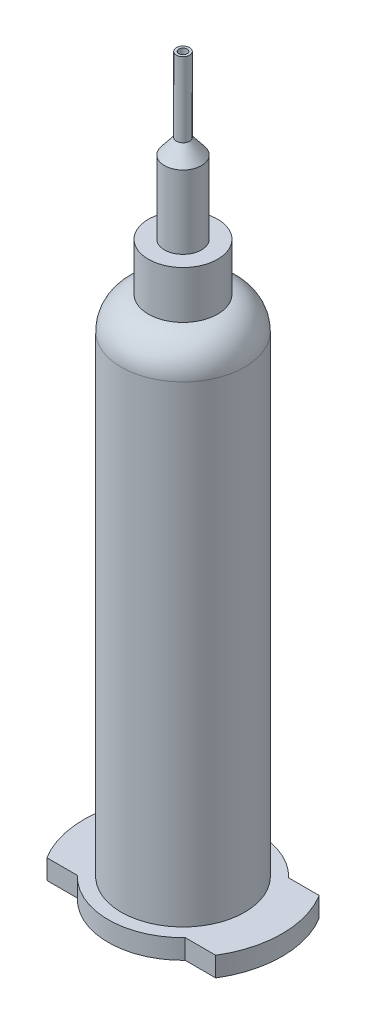
ISO-10303-21;
HEADER;
FILE_DESCRIPTION(('STEP AP214'),'2;1');
FILE_NAME('part.step','',(''),(''),'','','');
FILE_SCHEMA(('AUTOMOTIVE_DESIGN { 1 0 10303 214 1 1 1 1 }'));
ENDSEC;
DATA;
#1=APPLICATION_CONTEXT('core data for automotive mechanical design processes');
#2=APPLICATION_PROTOCOL_DEFINITION('international standard','automotive_design',2000,#1);
#3=PRODUCT_CONTEXT('',#1,'mechanical');
#4=PRODUCT('Part','Part','',(#3));
#5=PRODUCT_RELATED_PRODUCT_CATEGORY('part','',(#4));
#6=PRODUCT_DEFINITION_FORMATION('','',#4);
#7=PRODUCT_DEFINITION_CONTEXT('part definition',#1,'design');
#8=PRODUCT_DEFINITION('design','',#6,#7);
#9=PRODUCT_DEFINITION_SHAPE('','',#8);
#10=(LENGTH_UNIT() NAMED_UNIT(*) SI_UNIT(.MILLI.,.METRE.));
#11=(NAMED_UNIT(*) PLANE_ANGLE_UNIT() SI_UNIT($,.RADIAN.));
#12=(NAMED_UNIT(*) SI_UNIT($,.STERADIAN.) SOLID_ANGLE_UNIT());
#13=UNCERTAINTY_MEASURE_WITH_UNIT(LENGTH_MEASURE(1.E-05),#10,'distance_accuracy_value','');
#14=(GEOMETRIC_REPRESENTATION_CONTEXT(3) GLOBAL_UNCERTAINTY_ASSIGNED_CONTEXT((#13)) GLOBAL_UNIT_ASSIGNED_CONTEXT((#10,
#11,#12)) REPRESENTATION_CONTEXT('',''));
#15=CARTESIAN_POINT('',(0.,0.,0.));
#16=DIRECTION('',(0.,0.,1.));
#17=DIRECTION('',(1.,0.,0.));
#18=AXIS2_PLACEMENT_3D('',#15,#16,#17);
#19=CARTESIAN_POINT('',(0.,1.62000000000002,0.));
#20=DIRECTION('',(0.,1.,0.));
#21=DIRECTION('',(0.,0.,1.));
#22=AXIS2_PLACEMENT_3D('',#19,#20,#21);
#23=CYLINDRICAL_SURFACE('',#22,7.925);
#24=CARTESIAN_POINT('',(0.,1.62000000000002,0.));
#25=DIRECTION('',(0.,1.,0.));
#26=DIRECTION('',(0.,0.,1.));
#27=AXIS2_PLACEMENT_3D('',#24,#25,#26);
#28=CIRCLE('',#27,7.925);
#29=CARTESIAN_POINT('',(0.,1.62000000000002,7.925));
#30=VERTEX_POINT('',#29);
#31=EDGE_CURVE('E11',#30,#30,#28,.T.);
#32=ORIENTED_EDGE('',*,*,#31,.T.);
#33=EDGE_LOOP('',(#32));
#34=FACE_BOUND('',#33,.T.);
#35=CARTESIAN_POINT('',(0.,16.62,0.));
#36=DIRECTION('',(0.,1.,0.));
#37=DIRECTION('',(0.,0.,1.));
#38=AXIS2_PLACEMENT_3D('',#35,#36,#37);
#39=CIRCLE('',#38,7.925);
#40=CARTESIAN_POINT('',(0.,16.62,7.925));
#41=VERTEX_POINT('',#40);
#42=EDGE_CURVE('E52',#41,#41,#39,.T.);
#43=ORIENTED_EDGE('',*,*,#42,.F.);
#44=EDGE_LOOP('',(#43));
#45=FACE_BOUND('',#44,.T.);
#46=ADVANCED_FACE('F49',(#34,#45),#23,.T.);
#47=CARTESIAN_POINT('',(0.,1.62000000000002,0.));
#48=DIRECTION('',(0.,1.,0.));
#49=DIRECTION('',(0.,0.,1.));
#50=AXIS2_PLACEMENT_3D('',#47,#48,#49);
#51=PLANE('',#50);
#52=ORIENTED_EDGE('',*,*,#31,.F.);
#53=EDGE_LOOP('',(#52));
#54=FACE_BOUND('',#53,.T.);
#55=ADVANCED_FACE('F64',(#54),#51,.F.);
#56=CARTESIAN_POINT('',(0.,16.62,0.));
#57=DIRECTION('',(0.,1.,0.));
#58=DIRECTION('',(0.,0.,1.));
#59=AXIS2_PLACEMENT_3D('',#56,#57,#58);
#60=PLANE('',#59);
#61=ORIENTED_EDGE('',*,*,#42,.T.);
#62=EDGE_LOOP('',(#61));
#63=FACE_BOUND('',#62,.T.);
#64=ADVANCED_FACE('F61',(#63),#60,.T.);
#65=CLOSED_SHELL('',(#46,#55,#64));
#66=MANIFOLD_SOLID_BREP('B2',#65);
#67=CARTESIAN_POINT('',(0.,24.5223538498266,0.));
#68=DIRECTION('',(0.,1.,0.));
#69=DIRECTION('',(0.,0.,1.));
#70=AXIS2_PLACEMENT_3D('',#67,#68,#69);
#71=CYLINDRICAL_SURFACE('',#70,15.075);
#72=DIRECTION('',(0.,1.,0.));
#73=VECTOR('',#72,1.);
#74=CARTESIAN_POINT('',(-12.8545711713771,-84.0783145535444,-7.875));
#75=LINE('',#74,#73);
#76=CARTESIAN_POINT('',(-12.8545711713771,-57.38,-7.875));
#77=VERTEX_POINT('',#76);
#78=CARTESIAN_POINT('',(-12.8545711713771,-54.38,-7.875));
#79=VERTEX_POINT('',#78);
#80=EDGE_CURVE('E194',#77,#79,#75,.T.);
#81=ORIENTED_EDGE('',*,*,#80,.F.);
#82=CARTESIAN_POINT('',(0.,-57.38,0.));
#83=DIRECTION('',(0.,1.,0.));
#84=DIRECTION('',(0.,0.,1.));
#85=AXIS2_PLACEMENT_3D('',#82,#83,#84);
#86=CIRCLE('',#85,15.075);
#87=CARTESIAN_POINT('',(-12.8545711713771,-57.38,7.875));
#88=VERTEX_POINT('',#87);
#89=EDGE_CURVE('E182',#77,#88,#86,.T.);
#90=ORIENTED_EDGE('',*,*,#89,.T.);
#91=DIRECTION('',(0.,1.,0.));
#92=VECTOR('',#91,1.);
#93=CARTESIAN_POINT('',(-12.8545711713771,-84.0783145535444,7.875));
#94=LINE('',#93,#92);
#95=CARTESIAN_POINT('',(-12.8545711713771,-54.38,7.875));
#96=VERTEX_POINT('',#95);
#97=EDGE_CURVE('E200',#88,#96,#94,.T.);
#98=ORIENTED_EDGE('',*,*,#97,.T.);
#99=CARTESIAN_POINT('',(0.,-54.38,0.));
#100=DIRECTION('',(0.,1.,0.));
#101=DIRECTION('',(0.,0.,1.));
#102=AXIS2_PLACEMENT_3D('',#99,#100,#101);
#103=CIRCLE('',#102,15.075);
#104=EDGE_CURVE('E197',#79,#96,#103,.T.);
#105=ORIENTED_EDGE('',*,*,#104,.F.);
#106=EDGE_LOOP('',(#81,#90,#98,#105));
#107=FACE_BOUND('',#106,.T.);
#108=ADVANCED_FACE('F96',(#107),#71,.T.);
#109=CARTESIAN_POINT('',(0.,24.5223538498266,0.));
#110=DIRECTION('',(0.,1.,0.));
#111=DIRECTION('',(0.,0.,1.));
#112=AXIS2_PLACEMENT_3D('',#109,#110,#111);
#113=CYLINDRICAL_SURFACE('',#112,1.00000000000001);
#114=CARTESIAN_POINT('',(0.,43.03,0.));
#115=DIRECTION('',(0.,1.,0.));
#116=DIRECTION('',(0.,0.,1.));
#117=AXIS2_PLACEMENT_3D('',#114,#115,#116);
#118=CIRCLE('',#117,1.00000000000001);
#119=CARTESIAN_POINT('',(0.,43.03,1.00000000000001));
#120=VERTEX_POINT('',#119);
#121=EDGE_CURVE('E225',#120,#120,#118,.T.);
#122=ORIENTED_EDGE('',*,*,#121,.T.);
#123=EDGE_LOOP('',(#122));
#124=FACE_BOUND('',#123,.T.);
#125=CARTESIAN_POINT('',(0.,54.38,0.));
#126=DIRECTION('',(0.,1.,0.));
#127=DIRECTION('',(0.,0.,1.));
#128=AXIS2_PLACEMENT_3D('',#125,#126,#127);
#129=CIRCLE('',#128,1.00000000000001);
#130=CARTESIAN_POINT('',(0.,54.38,1.00000000000001));
#131=VERTEX_POINT('',#130);
#132=EDGE_CURVE('E222',#131,#131,#129,.T.);
#133=ORIENTED_EDGE('',*,*,#132,.F.);
#134=EDGE_LOOP('',(#133));
#135=FACE_BOUND('',#134,.T.);
#136=ADVANCED_FACE('F285',(#124,#135),#113,.T.);
#137=CARTESIAN_POINT('',(0.,54.38,0.));
#138=DIRECTION('',(0.,1.,0.));
#139=DIRECTION('',(0.,0.,1.));
#140=AXIS2_PLACEMENT_3D('',#137,#138,#139);
#141=PLANE('',#140);
#142=CARTESIAN_POINT('',(0.,54.38,0.));
#143=DIRECTION('',(0.,1.,0.));
#144=DIRECTION('',(0.,0.,1.));
#145=AXIS2_PLACEMENT_3D('',#142,#143,#144);
#146=CIRCLE('',#145,0.627370955077484);
#147=CARTESIAN_POINT('',(0.,54.38,0.627370955077484));
#148=VERTEX_POINT('',#147);
#149=EDGE_CURVE('E356',#148,#148,#146,.T.);
#150=ORIENTED_EDGE('',*,*,#149,.F.);
#151=EDGE_LOOP('',(#150));
#152=FACE_BOUND('',#151,.T.);
#153=ORIENTED_EDGE('',*,*,#132,.T.);
#154=EDGE_LOOP('',(#153));
#155=FACE_BOUND('',#154,.T.);
#156=ADVANCED_FACE('F283',(#152,#155),#141,.T.);
#157=CARTESIAN_POINT('',(0.,43.03,0.));
#158=DIRECTION('',(0.,-1.,0.));
#159=DIRECTION('',(0.,0.,-1.));
#160=AXIS2_PLACEMENT_3D('',#157,#158,#159);
#161=CONICAL_SURFACE('',#160,1.00000000000001,0.672874277724977);
#162=CARTESIAN_POINT('',(0.,40.74,0.));
#163=DIRECTION('',(0.,1.,0.));
#164=DIRECTION('',(0.,0.,1.));
#165=AXIS2_PLACEMENT_3D('',#162,#163,#164);
#166=CIRCLE('',#165,2.825);
#167=CARTESIAN_POINT('',(0.,40.74,2.825));
#168=VERTEX_POINT('',#167);
#169=EDGE_CURVE('E229',#168,#168,#166,.T.);
#170=ORIENTED_EDGE('',*,*,#169,.T.);
#171=EDGE_LOOP('',(#170));
#172=FACE_BOUND('',#171,.T.);
#173=ORIENTED_EDGE('',*,*,#121,.F.);
#174=EDGE_LOOP('',(#173));
#175=FACE_BOUND('',#174,.T.);
#176=ADVANCED_FACE('F277',(#172,#175),#161,.T.);
#177=CARTESIAN_POINT('',(0.,24.5223538498266,0.));
#178=DIRECTION('',(0.,1.,0.));
#179=DIRECTION('',(0.,0.,1.));
#180=AXIS2_PLACEMENT_3D('',#177,#178,#179);
#181=CYLINDRICAL_SURFACE('',#180,2.825);
#182=CARTESIAN_POINT('',(0.,29.62,0.));
#183=DIRECTION('',(0.,1.,0.));
#184=DIRECTION('',(0.,0.,1.));
#185=AXIS2_PLACEMENT_3D('',#182,#183,#184);
#186=CIRCLE('',#185,2.825);
#187=CARTESIAN_POINT('',(0.,29.62,2.825));
#188=VERTEX_POINT('',#187);
#189=EDGE_CURVE('E232',#188,#188,#186,.T.);
#190=ORIENTED_EDGE('',*,*,#189,.T.);
#191=EDGE_LOOP('',(#190));
#192=FACE_BOUND('',#191,.T.);
#193=ORIENTED_EDGE('',*,*,#169,.F.);
#194=EDGE_LOOP('',(#193));
#195=FACE_BOUND('',#194,.T.);
#196=ADVANCED_FACE('F271',(#192,#195),#181,.T.);
#197=CARTESIAN_POINT('',(0.,29.62,0.));
#198=DIRECTION('',(0.,1.,0.));
#199=DIRECTION('',(0.,0.,1.));
#200=AXIS2_PLACEMENT_3D('',#197,#198,#199);
#201=PLANE('',#200);
#202=CARTESIAN_POINT('',(0.,29.62,0.));
#203=DIRECTION('',(0.,1.,0.));
#204=DIRECTION('',(0.,0.,1.));
#205=AXIS2_PLACEMENT_3D('',#202,#203,#204);
#206=CIRCLE('',#205,5.275);
#207=CARTESIAN_POINT('',(0.,29.62,5.275));
#208=VERTEX_POINT('',#207);
#209=EDGE_CURVE('E235',#208,#208,#206,.T.);
#210=ORIENTED_EDGE('',*,*,#209,.T.);
#211=EDGE_LOOP('',(#210));
#212=FACE_BOUND('',#211,.T.);
#213=ORIENTED_EDGE('',*,*,#189,.F.);
#214=EDGE_LOOP('',(#213));
#215=FACE_BOUND('',#214,.T.);
#216=ADVANCED_FACE('F265',(#212,#215),#201,.T.);
#217=CARTESIAN_POINT('',(0.,24.5223538498266,0.));
#218=DIRECTION('',(0.,1.,0.));
#219=DIRECTION('',(0.,0.,1.));
#220=AXIS2_PLACEMENT_3D('',#217,#218,#219);
#221=CYLINDRICAL_SURFACE('',#220,5.275);
#222=CARTESIAN_POINT('',(0.,22.38,0.));
#223=DIRECTION('',(0.,1.,0.));
#224=DIRECTION('',(0.,0.,1.));
#225=AXIS2_PLACEMENT_3D('',#222,#223,#224);
#226=CIRCLE('',#225,5.275);
#227=CARTESIAN_POINT('',(0.,22.38,5.275));
#228=VERTEX_POINT('',#227);
#229=EDGE_CURVE('E238',#228,#228,#226,.T.);
#230=ORIENTED_EDGE('',*,*,#229,.T.);
#231=EDGE_LOOP('',(#230));
#232=FACE_BOUND('',#231,.T.);
#233=ORIENTED_EDGE('',*,*,#209,.F.);
#234=EDGE_LOOP('',(#233));
#235=FACE_BOUND('',#234,.T.);
#236=ADVANCED_FACE('F262',(#232,#235),#221,.T.);
#237=CARTESIAN_POINT('',(0.,24.5223538498266,0.));
#238=DIRECTION('',(0.,1.,0.));
#239=DIRECTION('',(0.,0.,1.));
#240=AXIS2_PLACEMENT_3D('',#237,#238,#239);
#241=CYLINDRICAL_SURFACE('',#240,9.4);
#242=CARTESIAN_POINT('',(0.,17.4571578331212,0.));
#243=DIRECTION('',(0.,1.,0.));
#244=DIRECTION('',(0.,0.,1.));
#245=AXIS2_PLACEMENT_3D('',#242,#243,#244);
#246=CIRCLE('',#245,9.4);
#247=CARTESIAN_POINT('',(0.,17.4571578331212,9.4));
#248=VERTEX_POINT('',#247);
#249=EDGE_CURVE('E104',#248,#248,#246,.F.);
#250=ORIENTED_EDGE('',*,*,#249,.T.);
#251=EDGE_LOOP('',(#250));
#252=FACE_BOUND('',#251,.T.);
#253=CARTESIAN_POINT('',(0.,-54.38,0.));
#254=DIRECTION('',(0.,1.,0.));
#255=DIRECTION('',(0.,0.,1.));
#256=AXIS2_PLACEMENT_3D('',#253,#254,#255);
#257=CIRCLE('',#256,9.4);
#258=CARTESIAN_POINT('',(0.,-54.38,9.4));
#259=VERTEX_POINT('',#258);
#260=EDGE_CURVE('E241',#259,#259,#257,.T.);
#261=ORIENTED_EDGE('',*,*,#260,.T.);
#262=EDGE_LOOP('',(#261));
#263=FACE_BOUND('',#262,.T.);
#264=ADVANCED_FACE('F251',(#252,#263),#241,.T.);
#265=CARTESIAN_POINT('',(15.075,-57.38,0.));
#266=DIRECTION('',(0.,-1.,0.));
#267=DIRECTION('',(0.,0.,-1.));
#268=AXIS2_PLACEMENT_3D('',#265,#266,#267);
#269=PLANE('',#268);
#270=CARTESIAN_POINT('',(0.,-57.38,0.));
#271=DIRECTION('',(0.,-1.,0.));
#272=DIRECTION('',(0.,0.,-1.));
#273=AXIS2_PLACEMENT_3D('',#270,#271,#272);
#274=CIRCLE('',#273,7.925);
#275=CARTESIAN_POINT('',(0.,-57.38,-7.925));
#276=VERTEX_POINT('',#275);
#277=EDGE_CURVE('E353',#276,#276,#274,.T.);
#278=ORIENTED_EDGE('',*,*,#277,.F.);
#279=EDGE_LOOP('',(#278));
#280=FACE_BOUND('',#279,.T.);
#281=DIRECTION('',(1.,0.,0.));
#282=VECTOR('',#281,1.);
#283=CARTESIAN_POINT('',(-12.8545711713771,-57.38,-7.875));
#284=LINE('',#283,#282);
#285=CARTESIAN_POINT('',(-8.208227579691,-57.38,-7.875));
#286=VERTEX_POINT('',#285);
#287=EDGE_CURVE('E173',#77,#286,#284,.T.);
#288=ORIENTED_EDGE('',*,*,#287,.T.);
#289=CARTESIAN_POINT('',(0.,-57.38,0.));
#290=DIRECTION('',(0.,-1.,0.));
#291=DIRECTION('',(0.,0.,-1.));
#292=AXIS2_PLACEMENT_3D('',#289,#290,#291);
#293=CIRCLE('',#292,11.375);
#294=CARTESIAN_POINT('',(8.208227579691,-57.38,-7.875));
#295=VERTEX_POINT('',#294);
#296=EDGE_CURVE('E161',#286,#295,#293,.T.);
#297=ORIENTED_EDGE('',*,*,#296,.T.);
#298=DIRECTION('',(1.,0.,0.));
#299=VECTOR('',#298,1.);
#300=CARTESIAN_POINT('',(8.208227579691,-57.38,-7.875));
#301=LINE('',#300,#299);
#302=CARTESIAN_POINT('',(12.8545711713771,-57.38,-7.875));
#303=VERTEX_POINT('',#302);
#304=EDGE_CURVE('E189',#295,#303,#301,.T.);
#305=ORIENTED_EDGE('',*,*,#304,.T.);
#306=CARTESIAN_POINT('',(12.8545711713771,-57.38,7.875));
#307=VERTEX_POINT('',#306);
#308=EDGE_CURVE('E226',#307,#303,#86,.T.);
#309=ORIENTED_EDGE('',*,*,#308,.F.);
#310=DIRECTION('',(-1.,0.,0.));
#311=VECTOR('',#310,1.);
#312=CARTESIAN_POINT('',(8.208227579691,-57.38,7.875));
#313=LINE('',#312,#311);
#314=CARTESIAN_POINT('',(8.208227579691,-57.38,7.875));
#315=VERTEX_POINT('',#314);
#316=EDGE_CURVE('E204',#307,#315,#313,.T.);
#317=ORIENTED_EDGE('',*,*,#316,.T.);
#318=CARTESIAN_POINT('',(0.,-57.38,0.));
#319=DIRECTION('',(0.,-1.,0.));
#320=DIRECTION('',(0.,0.,-1.));
#321=AXIS2_PLACEMENT_3D('',#318,#319,#320);
#322=CIRCLE('',#321,11.375);
#323=CARTESIAN_POINT('',(-8.208227579691,-57.38,7.875));
#324=VERTEX_POINT('',#323);
#325=EDGE_CURVE('E205',#315,#324,#322,.T.);
#326=ORIENTED_EDGE('',*,*,#325,.T.);
#327=DIRECTION('',(-1.,0.,0.));
#328=VECTOR('',#327,1.);
#329=CARTESIAN_POINT('',(-12.8545711713771,-57.38,7.875));
#330=LINE('',#329,#328);
#331=EDGE_CURVE('E208',#324,#88,#330,.T.);
#332=ORIENTED_EDGE('',*,*,#331,.T.);
#333=ORIENTED_EDGE('',*,*,#89,.F.);
#334=EDGE_LOOP('',(#288,#297,#305,#309,#317,#326,#332,#333));
#335=FACE_BOUND('',#334,.T.);
#336=ADVANCED_FACE('F179',(#280,#335),#269,.T.);
#337=DIRECTION('',(0.,1.,0.));
#338=VECTOR('',#337,1.);
#339=CARTESIAN_POINT('',(12.8545711713771,-84.0783145535444,-7.875));
#340=LINE('',#339,#338);
#341=CARTESIAN_POINT('',(12.8545711713771,-54.38,-7.875));
#342=VERTEX_POINT('',#341);
#343=EDGE_CURVE('E190',#303,#342,#340,.T.);
#344=ORIENTED_EDGE('',*,*,#343,.T.);
#345=CARTESIAN_POINT('',(12.8545711713771,-54.38,7.875));
#346=VERTEX_POINT('',#345);
#347=EDGE_CURVE('E244',#346,#342,#103,.T.);
#348=ORIENTED_EDGE('',*,*,#347,.F.);
#349=DIRECTION('',(0.,1.,0.));
#350=VECTOR('',#349,1.);
#351=CARTESIAN_POINT('',(12.8545711713771,-84.0783145535444,7.875));
#352=LINE('',#351,#350);
#353=EDGE_CURVE('E198',#307,#346,#352,.T.);
#354=ORIENTED_EDGE('',*,*,#353,.F.);
#355=ORIENTED_EDGE('',*,*,#308,.T.);
#356=EDGE_LOOP('',(#344,#348,#354,#355));
#357=FACE_BOUND('',#356,.T.);
#358=ADVANCED_FACE('F259',(#357),#71,.T.);
#359=CARTESIAN_POINT('',(9.4,-54.38,0.));
#360=DIRECTION('',(0.,1.,0.));
#361=DIRECTION('',(0.,0.,1.));
#362=AXIS2_PLACEMENT_3D('',#359,#360,#361);
#363=PLANE('',#362);
#364=DIRECTION('',(1.,0.,0.));
#365=VECTOR('',#364,1.);
#366=CARTESIAN_POINT('',(-12.8545711713771,-54.38,-7.875));
#367=LINE('',#366,#365);
#368=CARTESIAN_POINT('',(-8.208227579691,-54.38,-7.875));
#369=VERTEX_POINT('',#368);
#370=EDGE_CURVE('E176',#79,#369,#367,.T.);
#371=ORIENTED_EDGE('',*,*,#370,.F.);
#372=ORIENTED_EDGE('',*,*,#104,.T.);
#373=DIRECTION('',(-1.,0.,0.));
#374=VECTOR('',#373,1.);
#375=CARTESIAN_POINT('',(-12.8545711713771,-54.38,7.875));
#376=LINE('',#375,#374);
#377=CARTESIAN_POINT('',(-8.20822757969101,-54.38,7.875));
#378=VERTEX_POINT('',#377);
#379=EDGE_CURVE('E216',#378,#96,#376,.T.);
#380=ORIENTED_EDGE('',*,*,#379,.F.);
#381=CARTESIAN_POINT('',(0.,-54.38,0.));
#382=DIRECTION('',(0.,-1.,0.));
#383=DIRECTION('',(0.,0.,1.));
#384=AXIS2_PLACEMENT_3D('',#381,#382,#383);
#385=CIRCLE('',#384,11.375);
#386=CARTESIAN_POINT('',(8.208227579691,-54.38,7.875));
#387=VERTEX_POINT('',#386);
#388=EDGE_CURVE('E119',#387,#378,#385,.T.);
#389=ORIENTED_EDGE('',*,*,#388,.F.);
#390=DIRECTION('',(-1.,0.,0.));
#391=VECTOR('',#390,1.);
#392=CARTESIAN_POINT('',(8.208227579691,-54.38,7.875));
#393=LINE('',#392,#391);
#394=EDGE_CURVE('E217',#346,#387,#393,.T.);
#395=ORIENTED_EDGE('',*,*,#394,.F.);
#396=ORIENTED_EDGE('',*,*,#347,.T.);
#397=DIRECTION('',(1.,0.,0.));
#398=VECTOR('',#397,1.);
#399=CARTESIAN_POINT('',(8.208227579691,-54.38,-7.875));
#400=LINE('',#399,#398);
#401=CARTESIAN_POINT('',(8.208227579691,-54.38,-7.875));
#402=VERTEX_POINT('',#401);
#403=EDGE_CURVE('E183',#402,#342,#400,.T.);
#404=ORIENTED_EDGE('',*,*,#403,.F.);
#405=CARTESIAN_POINT('',(0.,-54.38,0.));
#406=DIRECTION('',(0.,-1.,0.));
#407=DIRECTION('',(0.,0.,-1.));
#408=AXIS2_PLACEMENT_3D('',#405,#406,#407);
#409=CIRCLE('',#408,11.375);
#410=EDGE_CURVE('E111',#369,#402,#409,.T.);
#411=ORIENTED_EDGE('',*,*,#410,.F.);
#412=EDGE_LOOP('',(#371,#372,#380,#389,#395,#396,#404,#411));
#413=FACE_BOUND('',#412,.T.);
#414=ORIENTED_EDGE('',*,*,#260,.F.);
#415=EDGE_LOOP('',(#414));
#416=FACE_BOUND('',#415,.T.);
#417=ADVANCED_FACE('F258',(#413,#416),#363,.T.);
#418=CARTESIAN_POINT('',(0.,17.4571578331212,0.));
#419=DIRECTION('',(0.,1.,0.));
#420=DIRECTION('',(0.,0.,1.));
#421=AXIS2_PLACEMENT_3D('',#418,#419,#420);
#422=DEGENERATE_TOROIDAL_SURFACE('',#421,4.4,5.,.T.);
#423=ORIENTED_EDGE('',*,*,#249,.F.);
#424=EDGE_LOOP('',(#423));
#425=FACE_BOUND('',#424,.T.);
#426=ORIENTED_EDGE('',*,*,#229,.F.);
#427=EDGE_LOOP('',(#426));
#428=FACE_BOUND('',#427,.T.);
#429=ADVANCED_FACE('F254',(#425,#428),#422,.T.);
#430=CARTESIAN_POINT('',(8.208227579691,-84.0783145535444,7.875));
#431=DIRECTION('',(0.,0.,-1.));
#432=DIRECTION('',(-1.,0.,0.));
#433=AXIS2_PLACEMENT_3D('',#430,#431,#432);
#434=PLANE('',#433);
#435=ORIENTED_EDGE('',*,*,#353,.T.);
#436=ORIENTED_EDGE('',*,*,#394,.T.);
#437=DIRECTION('',(0.,1.,0.));
#438=VECTOR('',#437,1.);
#439=CARTESIAN_POINT('',(8.208227579691,-84.0783145535444,7.875));
#440=LINE('',#439,#438);
#441=EDGE_CURVE('E202',#315,#387,#440,.T.);
#442=ORIENTED_EDGE('',*,*,#441,.F.);
#443=ORIENTED_EDGE('',*,*,#316,.F.);
#444=EDGE_LOOP('',(#435,#436,#442,#443));
#445=FACE_BOUND('',#444,.T.);
#446=ADVANCED_FACE('F257',(#445),#434,.F.);
#447=CARTESIAN_POINT('',(0.,-84.0783145535444,0.));
#448=DIRECTION('',(0.,1.,0.));
#449=DIRECTION('',(0.,0.,1.));
#450=AXIS2_PLACEMENT_3D('',#447,#448,#449);
#451=CYLINDRICAL_SURFACE('',#450,11.375);
#452=ORIENTED_EDGE('',*,*,#441,.T.);
#453=ORIENTED_EDGE('',*,*,#388,.T.);
#454=DIRECTION('',(0.,1.,0.));
#455=VECTOR('',#454,1.);
#456=CARTESIAN_POINT('',(-8.208227579691,-84.0783145535444,7.875));
#457=LINE('',#456,#455);
#458=EDGE_CURVE('E206',#324,#378,#457,.T.);
#459=ORIENTED_EDGE('',*,*,#458,.F.);
#460=ORIENTED_EDGE('',*,*,#325,.F.);
#461=EDGE_LOOP('',(#452,#453,#459,#460));
#462=FACE_BOUND('',#461,.T.);
#463=ADVANCED_FACE('F344',(#462),#451,.T.);
#464=CARTESIAN_POINT('',(-12.8545711713771,-84.0783145535444,7.875));
#465=DIRECTION('',(0.,0.,-1.));
#466=DIRECTION('',(-1.,0.,0.));
#467=AXIS2_PLACEMENT_3D('',#464,#465,#466);
#468=PLANE('',#467);
#469=ORIENTED_EDGE('',*,*,#458,.T.);
#470=ORIENTED_EDGE('',*,*,#379,.T.);
#471=ORIENTED_EDGE('',*,*,#97,.F.);
#472=ORIENTED_EDGE('',*,*,#331,.F.);
#473=EDGE_LOOP('',(#469,#470,#471,#472));
#474=FACE_BOUND('',#473,.T.);
#475=ADVANCED_FACE('F341',(#474),#468,.F.);
#476=CARTESIAN_POINT('',(-12.8545711713771,-84.0783145535444,-7.875));
#477=DIRECTION('',(0.,0.,1.));
#478=DIRECTION('',(1.,0.,0.));
#479=AXIS2_PLACEMENT_3D('',#476,#477,#478);
#480=PLANE('',#479);
#481=ORIENTED_EDGE('',*,*,#80,.T.);
#482=ORIENTED_EDGE('',*,*,#370,.T.);
#483=DIRECTION('',(0.,1.,0.));
#484=VECTOR('',#483,1.);
#485=CARTESIAN_POINT('',(-8.208227579691,-84.0783145535444,-7.875));
#486=LINE('',#485,#484);
#487=EDGE_CURVE('E164',#286,#369,#486,.T.);
#488=ORIENTED_EDGE('',*,*,#487,.F.);
#489=ORIENTED_EDGE('',*,*,#287,.F.);
#490=EDGE_LOOP('',(#481,#482,#488,#489));
#491=FACE_BOUND('',#490,.T.);
#492=ADVANCED_FACE('F172',(#491),#480,.F.);
#493=CARTESIAN_POINT('',(0.,-84.0783145535444,0.));
#494=DIRECTION('',(0.,1.,0.));
#495=DIRECTION('',(0.,0.,1.));
#496=AXIS2_PLACEMENT_3D('',#493,#494,#495);
#497=CYLINDRICAL_SURFACE('',#496,11.375);
#498=ORIENTED_EDGE('',*,*,#487,.T.);
#499=ORIENTED_EDGE('',*,*,#410,.T.);
#500=DIRECTION('',(0.,1.,0.));
#501=VECTOR('',#500,1.);
#502=CARTESIAN_POINT('',(8.208227579691,-84.0783145535444,-7.875));
#503=LINE('',#502,#501);
#504=EDGE_CURVE('E166',#295,#402,#503,.T.);
#505=ORIENTED_EDGE('',*,*,#504,.F.);
#506=ORIENTED_EDGE('',*,*,#296,.F.);
#507=EDGE_LOOP('',(#498,#499,#505,#506));
#508=FACE_BOUND('',#507,.T.);
#509=ADVANCED_FACE('F163',(#508),#497,.T.);
#510=CARTESIAN_POINT('',(8.208227579691,-84.0783145535444,-7.875));
#511=DIRECTION('',(0.,0.,1.));
#512=DIRECTION('',(1.,0.,0.));
#513=AXIS2_PLACEMENT_3D('',#510,#511,#512);
#514=PLANE('',#513);
#515=ORIENTED_EDGE('',*,*,#504,.T.);
#516=ORIENTED_EDGE('',*,*,#403,.T.);
#517=ORIENTED_EDGE('',*,*,#343,.F.);
#518=ORIENTED_EDGE('',*,*,#304,.F.);
#519=EDGE_LOOP('',(#515,#516,#517,#518));
#520=FACE_BOUND('',#519,.T.);
#521=ADVANCED_FACE('F325',(#520),#514,.F.);
#522=CARTESIAN_POINT('',(0.,16.62,0.));
#523=DIRECTION('',(0.,-1.,0.));
#524=DIRECTION('',(0.,0.,-1.));
#525=AXIS2_PLACEMENT_3D('',#522,#523,#524);
#526=CYLINDRICAL_SURFACE('',#525,7.925);
#527=CARTESIAN_POINT('',(0.,16.62,0.));
#528=DIRECTION('',(0.,-1.,0.));
#529=DIRECTION('',(0.,0.,-1.));
#530=AXIS2_PLACEMENT_3D('',#527,#528,#529);
#531=CIRCLE('',#530,7.925);
#532=CARTESIAN_POINT('',(0.,16.62,-7.925));
#533=VERTEX_POINT('',#532);
#534=EDGE_CURVE('E201',#533,#533,#531,.T.);
#535=ORIENTED_EDGE('',*,*,#534,.F.);
#536=EDGE_LOOP('',(#535));
#537=FACE_BOUND('',#536,.T.);
#538=ORIENTED_EDGE('',*,*,#277,.T.);
#539=EDGE_LOOP('',(#538));
#540=FACE_BOUND('',#539,.T.);
#541=ADVANCED_FACE('F327',(#537,#540),#526,.F.);
#542=CARTESIAN_POINT('',(0.,13.38,0.));
#543=DIRECTION('',(0.,1.,0.));
#544=DIRECTION('',(0.,0.,1.));
#545=AXIS2_PLACEMENT_3D('',#542,#543,#544);
#546=CYLINDRICAL_SURFACE('',#545,0.627370955077484);
#547=CARTESIAN_POINT('',(0.,26.2479380565703,0.));
#548=DIRECTION('',(0.,-1.,0.));
#549=DIRECTION('',(0.,0.,-1.));
#550=AXIS2_PLACEMENT_3D('',#547,#548,#549);
#551=CIRCLE('',#550,0.627370955077484);
#552=CARTESIAN_POINT('',(0.,26.2479380565703,-0.627370955077484));
#553=VERTEX_POINT('',#552);
#554=EDGE_CURVE('E47',#553,#553,#551,.T.);
#555=ORIENTED_EDGE('',*,*,#554,.T.);
#556=EDGE_LOOP('',(#555));
#557=FACE_BOUND('',#556,.T.);
#558=ORIENTED_EDGE('',*,*,#149,.T.);
#559=EDGE_LOOP('',(#558));
#560=FACE_BOUND('',#559,.T.);
#561=ADVANCED_FACE('F333',(#557,#560),#546,.F.);
#562=CARTESIAN_POINT('',(0.,26.2479380565703,0.));
#563=DIRECTION('',(0.,-1.,0.));
#564=DIRECTION('',(0.,0.,-1.));
#565=AXIS2_PLACEMENT_3D('',#562,#563,#564);
#566=TOROIDAL_SURFACE('',#565,10.6273709550775,10.);
#567=ORIENTED_EDGE('',*,*,#534,.T.);
#568=EDGE_LOOP('',(#567));
#569=FACE_BOUND('',#568,.T.);
#570=ORIENTED_EDGE('',*,*,#554,.F.);
#571=EDGE_LOOP('',(#570));
#572=FACE_BOUND('',#571,.T.);
#573=ADVANCED_FACE('F98',(#569,#572),#566,.T.);
#574=CLOSED_SHELL('',(#108,#136,#156,#176,#196,#216,#236,#264,#336,#358,#417,#429,#446,#463,
#475,#492,#509,#521,#541,#561,#573));
#575=MANIFOLD_SOLID_BREP('B6',#574);
#576=ADVANCED_BREP_SHAPE_REPRESENTATION('',(#18,#66,#575),#14);
#577=SHAPE_DEFINITION_REPRESENTATION(#9,#576);
ENDSEC;
END-ISO-10303-21;
